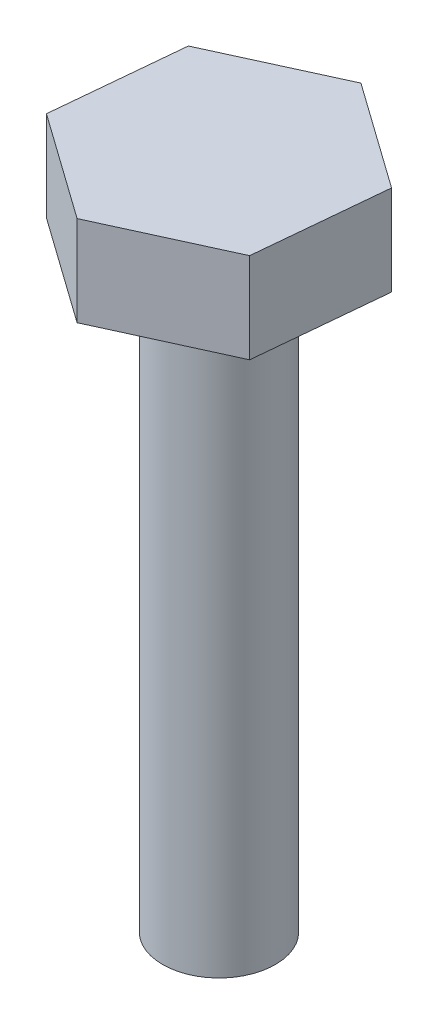
ISO-10303-21;
HEADER;
FILE_DESCRIPTION(('STEP AP214'),'2;1');
FILE_NAME('part.step','',(''),(''),'','','');
FILE_SCHEMA(('AUTOMOTIVE_DESIGN { 1 0 10303 214 1 1 1 1 }'));
ENDSEC;
DATA;
#1=APPLICATION_CONTEXT('core data for automotive mechanical design processes');
#2=APPLICATION_PROTOCOL_DEFINITION('international standard','automotive_design',2000,#1);
#3=PRODUCT_CONTEXT('',#1,'mechanical');
#4=PRODUCT('Part','Part','',(#3));
#5=PRODUCT_RELATED_PRODUCT_CATEGORY('part','',(#4));
#6=PRODUCT_DEFINITION_FORMATION('','',#4);
#7=PRODUCT_DEFINITION_CONTEXT('part definition',#1,'design');
#8=PRODUCT_DEFINITION('design','',#6,#7);
#9=PRODUCT_DEFINITION_SHAPE('','',#8);
#10=(LENGTH_UNIT() NAMED_UNIT(*) SI_UNIT(.MILLI.,.METRE.));
#11=(NAMED_UNIT(*) PLANE_ANGLE_UNIT() SI_UNIT($,.RADIAN.));
#12=(NAMED_UNIT(*) SI_UNIT($,.STERADIAN.) SOLID_ANGLE_UNIT());
#13=UNCERTAINTY_MEASURE_WITH_UNIT(LENGTH_MEASURE(1.E-05),#10,'distance_accuracy_value','');
#14=(GEOMETRIC_REPRESENTATION_CONTEXT(3) GLOBAL_UNCERTAINTY_ASSIGNED_CONTEXT((#13)) GLOBAL_UNIT_ASSIGNED_CONTEXT((#10,
#11,#12)) REPRESENTATION_CONTEXT('',''));
#15=CARTESIAN_POINT('',(0.,0.,0.));
#16=DIRECTION('',(0.,0.,1.));
#17=DIRECTION('',(1.,0.,0.));
#18=AXIS2_PLACEMENT_3D('',#15,#16,#17);
#19=CARTESIAN_POINT('',(0.,1.3,0.));
#20=DIRECTION('',(0.,-1.,0.));
#21=DIRECTION('',(0.,0.,-1.));
#22=AXIS2_PLACEMENT_3D('',#19,#20,#21);
#23=CYLINDRICAL_SURFACE('',#22,0.125);
#24=CARTESIAN_POINT('',(0.,1.3,0.));
#25=DIRECTION('',(0.,1.,0.));
#26=DIRECTION('',(0.,0.,1.));
#27=AXIS2_PLACEMENT_3D('',#24,#25,#26);
#28=CIRCLE('',#27,0.125);
#29=CARTESIAN_POINT('',(0.,1.3,0.125));
#30=VERTEX_POINT('',#29);
#31=EDGE_CURVE('E11',#30,#30,#28,.T.);
#32=ORIENTED_EDGE('',*,*,#31,.F.);
#33=EDGE_LOOP('',(#32));
#34=FACE_BOUND('',#33,.T.);
#35=CARTESIAN_POINT('',(0.,0.,0.));
#36=DIRECTION('',(0.,1.,0.));
#37=DIRECTION('',(0.,0.,1.));
#38=AXIS2_PLACEMENT_3D('',#35,#36,#37);
#39=CIRCLE('',#38,0.125);
#40=CARTESIAN_POINT('',(0.,0.,0.125));
#41=VERTEX_POINT('',#40);
#42=EDGE_CURVE('E42',#41,#41,#39,.T.);
#43=ORIENTED_EDGE('',*,*,#42,.T.);
#44=EDGE_LOOP('',(#43));
#45=FACE_BOUND('',#44,.T.);
#46=ADVANCED_FACE('F39',(#34,#45),#23,.T.);
#47=CARTESIAN_POINT('',(0.,0.,0.));
#48=DIRECTION('',(0.,1.,0.));
#49=DIRECTION('',(0.,0.,1.));
#50=AXIS2_PLACEMENT_3D('',#47,#48,#49);
#51=PLANE('',#50);
#52=ORIENTED_EDGE('',*,*,#42,.F.);
#53=EDGE_LOOP('',(#52));
#54=FACE_BOUND('',#53,.T.);
#55=ADVANCED_FACE('F164',(#54),#51,.F.);
#56=CARTESIAN_POINT('',(-0.0272651773224938,1.5,0.287384661105819));
#57=DIRECTION('',(-0.415969302383758,0.,-0.909378655717392));
#58=DIRECTION('',(-0.909378655717392,0.,0.415969302383758));
#59=AXIS2_PLACEMENT_3D('',#56,#57,#58);
#60=PLANE('',#59);
#61=DIRECTION('',(0.909378655717391,0.,-0.415969302383758));
#62=VECTOR('',#61,1.);
#63=CARTESIAN_POINT('',(-0.0272651773224938,1.3,0.287384661105819));
#64=LINE('',#63,#62);
#65=CARTESIAN_POINT('',(-0.0272651773224938,1.3,0.287384661105819));
#66=VERTEX_POINT('',#65);
#67=CARTESIAN_POINT('',(0.235249828514372,1.3,0.167304666752878));
#68=VERTEX_POINT('',#67);
#69=EDGE_CURVE('E129',#66,#68,#64,.T.);
#70=ORIENTED_EDGE('',*,*,#69,.T.);
#71=DIRECTION('',(0.,-1.,0.));
#72=VECTOR('',#71,1.);
#73=CARTESIAN_POINT('',(0.235249828514372,1.5,0.167304666752878));
#74=LINE('',#73,#72);
#75=CARTESIAN_POINT('',(0.235249828514372,1.5,0.167304666752878));
#76=VERTEX_POINT('',#75);
#77=EDGE_CURVE('E156',#76,#68,#74,.T.);
#78=ORIENTED_EDGE('',*,*,#77,.F.);
#79=DIRECTION('',(0.909378655717391,0.,-0.415969302383758));
#80=VECTOR('',#79,1.);
#81=CARTESIAN_POINT('',(-0.0272651773224938,1.5,0.287384661105819));
#82=LINE('',#81,#80);
#83=CARTESIAN_POINT('',(-0.0272651773224938,1.5,0.287384661105819));
#84=VERTEX_POINT('',#83);
#85=EDGE_CURVE('E145',#84,#76,#82,.T.);
#86=ORIENTED_EDGE('',*,*,#85,.F.);
#87=DIRECTION('',(0.,-1.,0.));
#88=VECTOR('',#87,1.);
#89=CARTESIAN_POINT('',(-0.0272651773224938,1.5,0.287384661105819));
#90=LINE('',#89,#88);
#91=EDGE_CURVE('E125',#84,#66,#90,.T.);
#92=ORIENTED_EDGE('',*,*,#91,.T.);
#93=EDGE_LOOP('',(#70,#78,#86,#92));
#94=FACE_BOUND('',#93,.T.);
#95=ADVANCED_FACE('F166',(#94),#60,.F.);
#96=CARTESIAN_POINT('',(0.235249828514372,1.5,0.167304666752878));
#97=DIRECTION('',(-0.995529668702483,0.,-0.09444934479987));
#98=DIRECTION('',(-0.09444934479987,0.,0.995529668702483));
#99=AXIS2_PLACEMENT_3D('',#96,#97,#98);
#100=PLANE('',#99);
#101=DIRECTION('',(0.09444934479987,0.,-0.995529668702483));
#102=VECTOR('',#101,1.);
#103=CARTESIAN_POINT('',(0.235249828514372,1.3,0.167304666752878));
#104=LINE('',#103,#102);
#105=CARTESIAN_POINT('',(0.262515005836867,1.3,-0.120079994352943));
#106=VERTEX_POINT('',#105);
#107=EDGE_CURVE('E133',#68,#106,#104,.T.);
#108=ORIENTED_EDGE('',*,*,#107,.T.);
#109=DIRECTION('',(0.,-1.,0.));
#110=VECTOR('',#109,1.);
#111=CARTESIAN_POINT('',(0.262515005836867,1.5,-0.120079994352943));
#112=LINE('',#111,#110);
#113=CARTESIAN_POINT('',(0.262515005836867,1.5,-0.120079994352943));
#114=VERTEX_POINT('',#113);
#115=EDGE_CURVE('E152',#114,#106,#112,.T.);
#116=ORIENTED_EDGE('',*,*,#115,.F.);
#117=DIRECTION('',(0.09444934479987,0.,-0.995529668702483));
#118=VECTOR('',#117,1.);
#119=CARTESIAN_POINT('',(0.235249828514372,1.5,0.167304666752878));
#120=LINE('',#119,#118);
#121=EDGE_CURVE('E94',#76,#114,#120,.T.);
#122=ORIENTED_EDGE('',*,*,#121,.F.);
#123=ORIENTED_EDGE('',*,*,#77,.T.);
#124=EDGE_LOOP('',(#108,#116,#122,#123));
#125=FACE_BOUND('',#124,.T.);
#126=ADVANCED_FACE('F171',(#125),#100,.F.);
#127=CARTESIAN_POINT('',(0.262515005836867,1.5,-0.120079994352943));
#128=DIRECTION('',(-0.579560366318724,0.,0.814929310917521));
#129=DIRECTION('',(0.814929310917521,0.,0.579560366318724));
#130=AXIS2_PLACEMENT_3D('',#127,#128,#129);
#131=PLANE('',#130);
#132=DIRECTION('',(-0.814929310917521,0.,-0.579560366318724));
#133=VECTOR('',#132,1.);
#134=CARTESIAN_POINT('',(0.262515005836867,1.3,-0.120079994352943));
#135=LINE('',#134,#133);
#136=CARTESIAN_POINT('',(0.027265177322493,1.3,-0.28738466110582));
#137=VERTEX_POINT('',#136);
#138=EDGE_CURVE('E136',#106,#137,#135,.T.);
#139=ORIENTED_EDGE('',*,*,#138,.T.);
#140=DIRECTION('',(0.,-1.,0.));
#141=VECTOR('',#140,1.);
#142=CARTESIAN_POINT('',(0.027265177322493,1.5,-0.28738466110582));
#143=LINE('',#142,#141);
#144=CARTESIAN_POINT('',(0.027265177322493,1.5,-0.28738466110582));
#145=VERTEX_POINT('',#144);
#146=EDGE_CURVE('E118',#145,#137,#143,.T.);
#147=ORIENTED_EDGE('',*,*,#146,.F.);
#148=DIRECTION('',(-0.814929310917521,0.,-0.579560366318724));
#149=VECTOR('',#148,1.);
#150=CARTESIAN_POINT('',(0.262515005836867,1.5,-0.120079994352943));
#151=LINE('',#150,#149);
#152=EDGE_CURVE('E107',#114,#145,#151,.T.);
#153=ORIENTED_EDGE('',*,*,#152,.F.);
#154=ORIENTED_EDGE('',*,*,#115,.T.);
#155=EDGE_LOOP('',(#139,#147,#153,#154));
#156=FACE_BOUND('',#155,.T.);
#157=ADVANCED_FACE('F178',(#156),#131,.F.);
#158=CARTESIAN_POINT('',(0.027265177322493,1.5,-0.28738466110582));
#159=DIRECTION('',(0.415969302383759,0.,0.909378655717391));
#160=DIRECTION('',(0.909378655717391,0.,-0.415969302383759));
#161=AXIS2_PLACEMENT_3D('',#158,#159,#160);
#162=PLANE('',#161);
#163=DIRECTION('',(-0.909378655717391,0.,0.415969302383759));
#164=VECTOR('',#163,1.);
#165=CARTESIAN_POINT('',(0.027265177322493,1.3,-0.28738466110582));
#166=LINE('',#165,#164);
#167=CARTESIAN_POINT('',(-0.235249828514375,1.3,-0.167304666752878));
#168=VERTEX_POINT('',#167);
#169=EDGE_CURVE('E116',#137,#168,#166,.T.);
#170=ORIENTED_EDGE('',*,*,#169,.T.);
#171=DIRECTION('',(0.,-1.,0.));
#172=VECTOR('',#171,1.);
#173=CARTESIAN_POINT('',(-0.235249828514375,1.5,-0.167304666752878));
#174=LINE('',#173,#172);
#175=CARTESIAN_POINT('',(-0.235249828514375,1.5,-0.167304666752878));
#176=VERTEX_POINT('',#175);
#177=EDGE_CURVE('E113',#176,#168,#174,.T.);
#178=ORIENTED_EDGE('',*,*,#177,.F.);
#179=DIRECTION('',(-0.909378655717391,0.,0.415969302383759));
#180=VECTOR('',#179,1.);
#181=CARTESIAN_POINT('',(0.027265177322493,1.5,-0.28738466110582));
#182=LINE('',#181,#180);
#183=EDGE_CURVE('E101',#145,#176,#182,.T.);
#184=ORIENTED_EDGE('',*,*,#183,.F.);
#185=ORIENTED_EDGE('',*,*,#146,.T.);
#186=EDGE_LOOP('',(#170,#178,#184,#185));
#187=FACE_BOUND('',#186,.T.);
#188=ADVANCED_FACE('F114',(#187),#162,.F.);
#189=CARTESIAN_POINT('',(-0.235249828514375,1.5,-0.167304666752878));
#190=DIRECTION('',(0.995529668702483,0.,0.0944493447998696));
#191=DIRECTION('',(0.0944493447998696,0.,-0.995529668702483));
#192=AXIS2_PLACEMENT_3D('',#189,#190,#191);
#193=PLANE('',#192);
#194=DIRECTION('',(-0.0944493447998696,0.,0.995529668702483));
#195=VECTOR('',#194,1.);
#196=CARTESIAN_POINT('',(-0.235249828514375,1.3,-0.167304666752878));
#197=LINE('',#196,#195);
#198=CARTESIAN_POINT('',(-0.26251500583687,1.3,0.12007999435294));
#199=VERTEX_POINT('',#198);
#200=EDGE_CURVE('E79',#168,#199,#197,.T.);
#201=ORIENTED_EDGE('',*,*,#200,.T.);
#202=DIRECTION('',(0.,-1.,0.));
#203=VECTOR('',#202,1.);
#204=CARTESIAN_POINT('',(-0.26251500583687,1.5,0.12007999435294));
#205=LINE('',#204,#203);
#206=CARTESIAN_POINT('',(-0.26251500583687,1.5,0.12007999435294));
#207=VERTEX_POINT('',#206);
#208=EDGE_CURVE('E119',#207,#199,#205,.T.);
#209=ORIENTED_EDGE('',*,*,#208,.F.);
#210=DIRECTION('',(-0.0944493447998696,0.,0.995529668702483));
#211=VECTOR('',#210,1.);
#212=CARTESIAN_POINT('',(-0.235249828514375,1.5,-0.167304666752878));
#213=LINE('',#212,#211);
#214=EDGE_CURVE('E105',#176,#207,#213,.T.);
#215=ORIENTED_EDGE('',*,*,#214,.F.);
#216=ORIENTED_EDGE('',*,*,#177,.T.);
#217=EDGE_LOOP('',(#201,#209,#215,#216));
#218=FACE_BOUND('',#217,.T.);
#219=ADVANCED_FACE('F121',(#218),#193,.F.);
#220=CARTESIAN_POINT('',(-0.26251500583687,1.5,0.12007999435294));
#221=DIRECTION('',(0.579560366318724,0.,-0.814929310917521));
#222=DIRECTION('',(-0.814929310917521,0.,-0.579560366318724));
#223=AXIS2_PLACEMENT_3D('',#220,#221,#222);
#224=PLANE('',#223);
#225=DIRECTION('',(0.814929310917521,0.,0.579560366318724));
#226=VECTOR('',#225,1.);
#227=CARTESIAN_POINT('',(-0.26251500583687,1.3,0.12007999435294));
#228=LINE('',#227,#226);
#229=EDGE_CURVE('E85',#199,#66,#228,.T.);
#230=ORIENTED_EDGE('',*,*,#229,.T.);
#231=ORIENTED_EDGE('',*,*,#91,.F.);
#232=DIRECTION('',(0.814929310917521,0.,0.579560366318724));
#233=VECTOR('',#232,1.);
#234=CARTESIAN_POINT('',(-0.26251500583687,1.5,0.12007999435294));
#235=LINE('',#234,#233);
#236=EDGE_CURVE('E56',#207,#84,#235,.T.);
#237=ORIENTED_EDGE('',*,*,#236,.F.);
#238=ORIENTED_EDGE('',*,*,#208,.T.);
#239=EDGE_LOOP('',(#230,#231,#237,#238));
#240=FACE_BOUND('',#239,.T.);
#241=ADVANCED_FACE('F186',(#240),#224,.F.);
#242=CARTESIAN_POINT('',(0.,1.5,0.));
#243=DIRECTION('',(0.,1.,0.));
#244=DIRECTION('',(0.,0.,1.));
#245=AXIS2_PLACEMENT_3D('',#242,#243,#244);
#246=PLANE('',#245);
#247=ORIENTED_EDGE('',*,*,#85,.T.);
#248=ORIENTED_EDGE('',*,*,#121,.T.);
#249=ORIENTED_EDGE('',*,*,#152,.T.);
#250=ORIENTED_EDGE('',*,*,#183,.T.);
#251=ORIENTED_EDGE('',*,*,#214,.T.);
#252=ORIENTED_EDGE('',*,*,#236,.T.);
#253=EDGE_LOOP('',(#247,#248,#249,#250,#251,#252));
#254=FACE_BOUND('',#253,.T.);
#255=ADVANCED_FACE('F103',(#254),#246,.T.);
#256=CARTESIAN_POINT('',(0.,1.3,0.));
#257=DIRECTION('',(0.,1.,0.));
#258=DIRECTION('',(0.,0.,1.));
#259=AXIS2_PLACEMENT_3D('',#256,#257,#258);
#260=PLANE('',#259);
#261=ORIENTED_EDGE('',*,*,#31,.T.);
#262=EDGE_LOOP('',(#261));
#263=FACE_BOUND('',#262,.T.);
#264=ORIENTED_EDGE('',*,*,#69,.F.);
#265=ORIENTED_EDGE('',*,*,#229,.F.);
#266=ORIENTED_EDGE('',*,*,#200,.F.);
#267=ORIENTED_EDGE('',*,*,#169,.F.);
#268=ORIENTED_EDGE('',*,*,#138,.F.);
#269=ORIENTED_EDGE('',*,*,#107,.F.);
#270=EDGE_LOOP('',(#264,#265,#266,#267,#268,#269));
#271=FACE_BOUND('',#270,.T.);
#272=ADVANCED_FACE('F189',(#263,#271),#260,.F.);
#273=CLOSED_SHELL('',(#46,#55,#95,#126,#157,#188,#219,#241,#255,#272));
#274=MANIFOLD_SOLID_BREP('B2',#273);
#275=ADVANCED_BREP_SHAPE_REPRESENTATION('',(#18,#274),#14);
#276=SHAPE_DEFINITION_REPRESENTATION(#9,#275);
ENDSEC;
END-ISO-10303-21;
